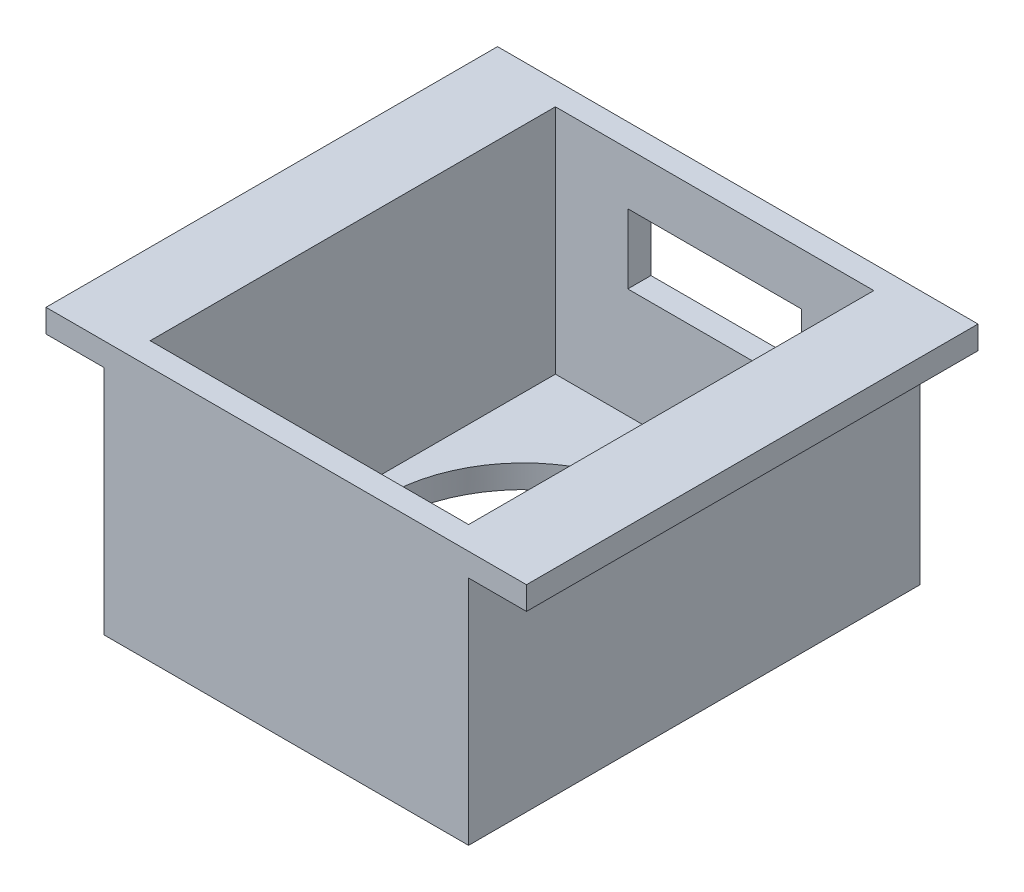
ISO-10303-21;
HEADER;
FILE_DESCRIPTION(('STEP AP214'),'2;1');
FILE_NAME('part.step','',(''),(''),'','','');
FILE_SCHEMA(('AUTOMOTIVE_DESIGN { 1 0 10303 214 1 1 1 1 }'));
ENDSEC;
DATA;
#1=APPLICATION_CONTEXT('core data for automotive mechanical design processes');
#2=APPLICATION_PROTOCOL_DEFINITION('international standard','automotive_design',2000,#1);
#3=PRODUCT_CONTEXT('',#1,'mechanical');
#4=PRODUCT('Part','Part','',(#3));
#5=PRODUCT_RELATED_PRODUCT_CATEGORY('part','',(#4));
#6=PRODUCT_DEFINITION_FORMATION('','',#4);
#7=PRODUCT_DEFINITION_CONTEXT('part definition',#1,'design');
#8=PRODUCT_DEFINITION('design','',#6,#7);
#9=PRODUCT_DEFINITION_SHAPE('','',#8);
#10=(LENGTH_UNIT() NAMED_UNIT(*) SI_UNIT(.MILLI.,.METRE.));
#11=(NAMED_UNIT(*) PLANE_ANGLE_UNIT() SI_UNIT($,.RADIAN.));
#12=(NAMED_UNIT(*) SI_UNIT($,.STERADIAN.) SOLID_ANGLE_UNIT());
#13=UNCERTAINTY_MEASURE_WITH_UNIT(LENGTH_MEASURE(1.E-05),#10,'distance_accuracy_value','');
#14=(GEOMETRIC_REPRESENTATION_CONTEXT(3) GLOBAL_UNCERTAINTY_ASSIGNED_CONTEXT((#13)) GLOBAL_UNIT_ASSIGNED_CONTEXT((#10,
#11,#12)) REPRESENTATION_CONTEXT('',''));
#15=CARTESIAN_POINT('',(0.,0.,0.));
#16=DIRECTION('',(0.,0.,1.));
#17=DIRECTION('',(1.,0.,0.));
#18=AXIS2_PLACEMENT_3D('',#15,#16,#17);
#19=CARTESIAN_POINT('',(34.5,-20.,37.));
#20=DIRECTION('',(1.,0.,0.));
#21=DIRECTION('',(0.,0.,-1.));
#22=AXIS2_PLACEMENT_3D('',#19,#20,#21);
#23=PLANE('',#22);
#24=DIRECTION('',(0.,1.,0.));
#25=VECTOR('',#24,1.);
#26=CARTESIAN_POINT('',(34.5,-20.,1.99999999999999));
#27=LINE('',#26,#25);
#28=CARTESIAN_POINT('',(34.5,-20.,1.99999999999999));
#29=VERTEX_POINT('',#28);
#30=CARTESIAN_POINT('',(34.5,0.,1.99999999999999));
#31=VERTEX_POINT('',#30);
#32=EDGE_CURVE('E183',#29,#31,#27,.T.);
#33=ORIENTED_EDGE('',*,*,#32,.F.);
#34=DIRECTION('',(0.,0.,-1.));
#35=VECTOR('',#34,1.);
#36=CARTESIAN_POINT('',(34.5,-20.,37.));
#37=LINE('',#36,#35);
#38=CARTESIAN_POINT('',(34.5,-20.,37.));
#39=VERTEX_POINT('',#38);
#40=EDGE_CURVE('E234',#39,#29,#37,.T.);
#41=ORIENTED_EDGE('',*,*,#40,.F.);
#42=DIRECTION('',(0.,-1.,0.));
#43=VECTOR('',#42,1.);
#44=CARTESIAN_POINT('',(34.5,-20.,37.));
#45=LINE('',#44,#43);
#46=CARTESIAN_POINT('',(34.5,0.,37.));
#47=VERTEX_POINT('',#46);
#48=EDGE_CURVE('E220',#47,#39,#45,.T.);
#49=ORIENTED_EDGE('',*,*,#48,.F.);
#50=DIRECTION('',(0.,0.,-1.));
#51=VECTOR('',#50,1.);
#52=CARTESIAN_POINT('',(34.5,0.,37.));
#53=LINE('',#52,#51);
#54=EDGE_CURVE('E231',#47,#31,#53,.T.);
#55=ORIENTED_EDGE('',*,*,#54,.T.);
#56=EDGE_LOOP('',(#33,#41,#49,#55));
#57=FACE_BOUND('',#56,.T.);
#58=ADVANCED_FACE('F33',(#57),#23,.F.);
#59=CARTESIAN_POINT('',(7.,-20.,37.));
#60=DIRECTION('',(0.,-1.,0.));
#61=DIRECTION('',(1.,0.,0.));
#62=AXIS2_PLACEMENT_3D('',#59,#60,#61);
#63=PLANE('',#62);
#64=CARTESIAN_POINT('',(20.75,-20.,18.5));
#65=DIRECTION('',(0.,-1.,0.));
#66=DIRECTION('',(1.,0.,0.));
#67=AXIS2_PLACEMENT_3D('',#64,#65,#66);
#68=CIRCLE('',#67,12.);
#69=CARTESIAN_POINT('',(32.75,-20.,18.5));
#70=VERTEX_POINT('',#69);
#71=EDGE_CURVE('E459',#70,#70,#68,.T.);
#72=ORIENTED_EDGE('',*,*,#71,.T.);
#73=EDGE_LOOP('',(#72));
#74=FACE_BOUND('',#73,.T.);
#75=DIRECTION('',(1.,0.,0.));
#76=VECTOR('',#75,1.);
#77=CARTESIAN_POINT('',(7.,-20.,1.99999999999999));
#78=LINE('',#77,#76);
#79=CARTESIAN_POINT('',(7.,-20.,1.99999999999999));
#80=VERTEX_POINT('',#79);
#81=EDGE_CURVE('E180',#80,#29,#78,.T.);
#82=ORIENTED_EDGE('',*,*,#81,.F.);
#83=DIRECTION('',(0.,0.,-1.));
#84=VECTOR('',#83,1.);
#85=CARTESIAN_POINT('',(7.,-20.,37.));
#86=LINE('',#85,#84);
#87=CARTESIAN_POINT('',(7.,-20.,37.));
#88=VERTEX_POINT('',#87);
#89=EDGE_CURVE('E332',#88,#80,#86,.T.);
#90=ORIENTED_EDGE('',*,*,#89,.F.);
#91=DIRECTION('',(-1.,0.,0.));
#92=VECTOR('',#91,1.);
#93=CARTESIAN_POINT('',(7.,-20.,37.));
#94=LINE('',#93,#92);
#95=EDGE_CURVE('E216',#39,#88,#94,.T.);
#96=ORIENTED_EDGE('',*,*,#95,.F.);
#97=ORIENTED_EDGE('',*,*,#40,.T.);
#98=EDGE_LOOP('',(#82,#90,#96,#97));
#99=FACE_BOUND('',#98,.T.);
#100=ADVANCED_FACE('F264',(#74,#99),#63,.F.);
#101=CARTESIAN_POINT('',(7.,0.,37.));
#102=DIRECTION('',(-1.,0.,0.));
#103=DIRECTION('',(0.,-1.,0.));
#104=AXIS2_PLACEMENT_3D('',#101,#102,#103);
#105=PLANE('',#104);
#106=DIRECTION('',(0.,-1.,0.));
#107=VECTOR('',#106,1.);
#108=CARTESIAN_POINT('',(7.,0.,1.99999999999999));
#109=LINE('',#108,#107);
#110=CARTESIAN_POINT('',(7.,0.,1.99999999999999));
#111=VERTEX_POINT('',#110);
#112=EDGE_CURVE('E177',#111,#80,#109,.T.);
#113=ORIENTED_EDGE('',*,*,#112,.F.);
#114=DIRECTION('',(0.,0.,-1.));
#115=VECTOR('',#114,1.);
#116=CARTESIAN_POINT('',(7.,0.,37.));
#117=LINE('',#116,#115);
#118=CARTESIAN_POINT('',(7.,0.,37.));
#119=VERTEX_POINT('',#118);
#120=EDGE_CURVE('E331',#119,#111,#117,.T.);
#121=ORIENTED_EDGE('',*,*,#120,.F.);
#122=DIRECTION('',(0.,1.,0.));
#123=VECTOR('',#122,1.);
#124=CARTESIAN_POINT('',(7.,0.,37.));
#125=LINE('',#124,#123);
#126=EDGE_CURVE('E219',#88,#119,#125,.T.);
#127=ORIENTED_EDGE('',*,*,#126,.F.);
#128=ORIENTED_EDGE('',*,*,#89,.T.);
#129=EDGE_LOOP('',(#113,#121,#127,#128));
#130=FACE_BOUND('',#129,.T.);
#131=ADVANCED_FACE('F270',(#130),#105,.F.);
#132=CARTESIAN_POINT('',(0.,-2.,37.));
#133=DIRECTION('',(1.,0.,0.));
#134=DIRECTION('',(0.,0.,-1.));
#135=AXIS2_PLACEMENT_3D('',#132,#133,#134);
#136=PLANE('',#135);
#137=DIRECTION('',(0.,-1.,0.));
#138=VECTOR('',#137,1.);
#139=CARTESIAN_POINT('',(0.,-2.,0.));
#140=LINE('',#139,#138);
#141=CARTESIAN_POINT('',(0.,0.,0.));
#142=VERTEX_POINT('',#141);
#143=CARTESIAN_POINT('',(0.,-2.,0.));
#144=VERTEX_POINT('',#143);
#145=EDGE_CURVE('E211',#142,#144,#140,.T.);
#146=ORIENTED_EDGE('',*,*,#145,.T.);
#147=DIRECTION('',(0.,0.,-1.));
#148=VECTOR('',#147,1.);
#149=CARTESIAN_POINT('',(0.,-2.,37.));
#150=LINE('',#149,#148);
#151=CARTESIAN_POINT('',(0.,-2.,39.));
#152=VERTEX_POINT('',#151);
#153=EDGE_CURVE('E244',#152,#144,#150,.T.);
#154=ORIENTED_EDGE('',*,*,#153,.F.);
#155=DIRECTION('',(0.,-1.,0.));
#156=VECTOR('',#155,1.);
#157=CARTESIAN_POINT('',(0.,-2.,39.));
#158=LINE('',#157,#156);
#159=CARTESIAN_POINT('',(0.,0.,39.));
#160=VERTEX_POINT('',#159);
#161=EDGE_CURVE('E187',#160,#152,#158,.T.);
#162=ORIENTED_EDGE('',*,*,#161,.F.);
#163=DIRECTION('',(0.,0.,-1.));
#164=VECTOR('',#163,1.);
#165=CARTESIAN_POINT('',(0.,0.,37.));
#166=LINE('',#165,#164);
#167=EDGE_CURVE('E228',#160,#142,#166,.T.);
#168=ORIENTED_EDGE('',*,*,#167,.T.);
#169=EDGE_LOOP('',(#146,#154,#162,#168));
#170=FACE_BOUND('',#169,.T.);
#171=ADVANCED_FACE('F35',(#170),#136,.F.);
#172=CARTESIAN_POINT('',(0.,-2.,37.));
#173=DIRECTION('',(0.,1.,0.));
#174=DIRECTION('',(0.,0.,1.));
#175=AXIS2_PLACEMENT_3D('',#172,#173,#174);
#176=PLANE('',#175);
#177=DIRECTION('',(1.,0.,0.));
#178=VECTOR('',#177,1.);
#179=CARTESIAN_POINT('',(0.,-2.,0.));
#180=LINE('',#179,#178);
#181=CARTESIAN_POINT('',(5.,-2.,0.));
#182=VERTEX_POINT('',#181);
#183=EDGE_CURVE('E304',#144,#182,#180,.T.);
#184=ORIENTED_EDGE('',*,*,#183,.T.);
#185=DIRECTION('',(0.,0.,-1.));
#186=VECTOR('',#185,1.);
#187=CARTESIAN_POINT('',(5.,-2.,37.));
#188=LINE('',#187,#186);
#189=CARTESIAN_POINT('',(5.,-2.,39.));
#190=VERTEX_POINT('',#189);
#191=EDGE_CURVE('E307',#190,#182,#188,.T.);
#192=ORIENTED_EDGE('',*,*,#191,.F.);
#193=DIRECTION('',(1.,0.,0.));
#194=VECTOR('',#193,1.);
#195=CARTESIAN_POINT('',(5.,-2.,39.));
#196=LINE('',#195,#194);
#197=EDGE_CURVE('E190',#152,#190,#196,.T.);
#198=ORIENTED_EDGE('',*,*,#197,.F.);
#199=ORIENTED_EDGE('',*,*,#153,.T.);
#200=EDGE_LOOP('',(#184,#192,#198,#199));
#201=FACE_BOUND('',#200,.T.);
#202=ADVANCED_FACE('F294',(#201),#176,.F.);
#203=CARTESIAN_POINT('',(5.,-2.,37.));
#204=DIRECTION('',(1.,0.,0.));
#205=DIRECTION('',(0.,1.,0.));
#206=AXIS2_PLACEMENT_3D('',#203,#204,#205);
#207=PLANE('',#206);
#208=DIRECTION('',(0.,-1.,0.));
#209=VECTOR('',#208,1.);
#210=CARTESIAN_POINT('',(5.,-2.,0.));
#211=LINE('',#210,#209);
#212=CARTESIAN_POINT('',(5.,-22.,0.));
#213=VERTEX_POINT('',#212);
#214=EDGE_CURVE('E310',#182,#213,#211,.T.);
#215=ORIENTED_EDGE('',*,*,#214,.T.);
#216=DIRECTION('',(0.,0.,-1.));
#217=VECTOR('',#216,1.);
#218=CARTESIAN_POINT('',(5.,-22.,37.));
#219=LINE('',#218,#217);
#220=CARTESIAN_POINT('',(5.,-22.,39.));
#221=VERTEX_POINT('',#220);
#222=EDGE_CURVE('E343',#221,#213,#219,.T.);
#223=ORIENTED_EDGE('',*,*,#222,.F.);
#224=DIRECTION('',(0.,-1.,0.));
#225=VECTOR('',#224,1.);
#226=CARTESIAN_POINT('',(5.,-22.,39.));
#227=LINE('',#226,#225);
#228=EDGE_CURVE('E193',#190,#221,#227,.T.);
#229=ORIENTED_EDGE('',*,*,#228,.F.);
#230=ORIENTED_EDGE('',*,*,#191,.T.);
#231=EDGE_LOOP('',(#215,#223,#229,#230));
#232=FACE_BOUND('',#231,.T.);
#233=ADVANCED_FACE('F291',(#232),#207,.F.);
#234=CARTESIAN_POINT('',(5.,-22.,37.));
#235=DIRECTION('',(0.,1.,0.));
#236=DIRECTION('',(0.,0.,1.));
#237=AXIS2_PLACEMENT_3D('',#234,#235,#236);
#238=PLANE('',#237);
#239=CARTESIAN_POINT('',(20.75,-22.,18.5));
#240=DIRECTION('',(0.,-1.,0.));
#241=DIRECTION('',(0.,0.,-1.));
#242=AXIS2_PLACEMENT_3D('',#239,#240,#241);
#243=CIRCLE('',#242,12.);
#244=CARTESIAN_POINT('',(20.75,-22.,6.5));
#245=VERTEX_POINT('',#244);
#246=EDGE_CURVE('E456',#245,#245,#243,.T.);
#247=ORIENTED_EDGE('',*,*,#246,.F.);
#248=EDGE_LOOP('',(#247));
#249=FACE_BOUND('',#248,.T.);
#250=DIRECTION('',(1.,0.,0.));
#251=VECTOR('',#250,1.);
#252=CARTESIAN_POINT('',(5.,-22.,0.));
#253=LINE('',#252,#251);
#254=CARTESIAN_POINT('',(36.5,-22.,0.));
#255=VERTEX_POINT('',#254);
#256=EDGE_CURVE('E315',#213,#255,#253,.T.);
#257=ORIENTED_EDGE('',*,*,#256,.T.);
#258=DIRECTION('',(0.,0.,-1.));
#259=VECTOR('',#258,1.);
#260=CARTESIAN_POINT('',(36.5,-22.,37.));
#261=LINE('',#260,#259);
#262=CARTESIAN_POINT('',(36.5,-22.,39.));
#263=VERTEX_POINT('',#262);
#264=EDGE_CURVE('E341',#263,#255,#261,.T.);
#265=ORIENTED_EDGE('',*,*,#264,.F.);
#266=DIRECTION('',(1.,0.,0.));
#267=VECTOR('',#266,1.);
#268=CARTESIAN_POINT('',(36.5,-22.,39.));
#269=LINE('',#268,#267);
#270=EDGE_CURVE('E196',#221,#263,#269,.T.);
#271=ORIENTED_EDGE('',*,*,#270,.F.);
#272=ORIENTED_EDGE('',*,*,#222,.T.);
#273=EDGE_LOOP('',(#257,#265,#271,#272));
#274=FACE_BOUND('',#273,.T.);
#275=ADVANCED_FACE('F287',(#249,#274),#238,.F.);
#276=CARTESIAN_POINT('',(36.5,-22.,37.));
#277=DIRECTION('',(-1.,0.,0.));
#278=DIRECTION('',(0.,0.,1.));
#279=AXIS2_PLACEMENT_3D('',#276,#277,#278);
#280=PLANE('',#279);
#281=DIRECTION('',(0.,1.,0.));
#282=VECTOR('',#281,1.);
#283=CARTESIAN_POINT('',(36.5,-22.,0.));
#284=LINE('',#283,#282);
#285=CARTESIAN_POINT('',(36.5,-2.,0.));
#286=VERTEX_POINT('',#285);
#287=EDGE_CURVE('E317',#255,#286,#284,.T.);
#288=ORIENTED_EDGE('',*,*,#287,.T.);
#289=DIRECTION('',(0.,0.,-1.));
#290=VECTOR('',#289,1.);
#291=CARTESIAN_POINT('',(36.5,-2.,37.));
#292=LINE('',#291,#290);
#293=CARTESIAN_POINT('',(36.5,-2.,39.));
#294=VERTEX_POINT('',#293);
#295=EDGE_CURVE('E339',#294,#286,#292,.T.);
#296=ORIENTED_EDGE('',*,*,#295,.F.);
#297=DIRECTION('',(0.,1.,0.));
#298=VECTOR('',#297,1.);
#299=CARTESIAN_POINT('',(36.5,-2.,39.));
#300=LINE('',#299,#298);
#301=EDGE_CURVE('E199',#263,#294,#300,.T.);
#302=ORIENTED_EDGE('',*,*,#301,.F.);
#303=ORIENTED_EDGE('',*,*,#264,.T.);
#304=EDGE_LOOP('',(#288,#296,#302,#303));
#305=FACE_BOUND('',#304,.T.);
#306=ADVANCED_FACE('F283',(#305),#280,.F.);
#307=CARTESIAN_POINT('',(36.5,-2.,37.));
#308=DIRECTION('',(0.,1.,0.));
#309=DIRECTION('',(0.,0.,1.));
#310=AXIS2_PLACEMENT_3D('',#307,#308,#309);
#311=PLANE('',#310);
#312=DIRECTION('',(1.,0.,0.));
#313=VECTOR('',#312,1.);
#314=CARTESIAN_POINT('',(36.5,-2.,0.));
#315=LINE('',#314,#313);
#316=CARTESIAN_POINT('',(41.5,-2.,0.));
#317=VERTEX_POINT('',#316);
#318=EDGE_CURVE('E322',#286,#317,#315,.T.);
#319=ORIENTED_EDGE('',*,*,#318,.T.);
#320=DIRECTION('',(0.,0.,-1.));
#321=VECTOR('',#320,1.);
#322=CARTESIAN_POINT('',(41.5,-2.,37.));
#323=LINE('',#322,#321);
#324=CARTESIAN_POINT('',(41.5,-2.,39.));
#325=VERTEX_POINT('',#324);
#326=EDGE_CURVE('E337',#325,#317,#323,.T.);
#327=ORIENTED_EDGE('',*,*,#326,.F.);
#328=DIRECTION('',(1.,0.,0.));
#329=VECTOR('',#328,1.);
#330=CARTESIAN_POINT('',(41.5,-2.,39.));
#331=LINE('',#330,#329);
#332=EDGE_CURVE('E202',#294,#325,#331,.T.);
#333=ORIENTED_EDGE('',*,*,#332,.F.);
#334=ORIENTED_EDGE('',*,*,#295,.T.);
#335=EDGE_LOOP('',(#319,#327,#333,#334));
#336=FACE_BOUND('',#335,.T.);
#337=ADVANCED_FACE('F279',(#336),#311,.F.);
#338=CARTESIAN_POINT('',(41.5,0.,37.));
#339=DIRECTION('',(-1.,0.,0.));
#340=DIRECTION('',(0.,0.,1.));
#341=AXIS2_PLACEMENT_3D('',#338,#339,#340);
#342=PLANE('',#341);
#343=DIRECTION('',(0.,1.,0.));
#344=VECTOR('',#343,1.);
#345=CARTESIAN_POINT('',(41.5,0.,0.));
#346=LINE('',#345,#344);
#347=CARTESIAN_POINT('',(41.5,0.,0.));
#348=VERTEX_POINT('',#347);
#349=EDGE_CURVE('E325',#317,#348,#346,.T.);
#350=ORIENTED_EDGE('',*,*,#349,.T.);
#351=DIRECTION('',(0.,0.,-1.));
#352=VECTOR('',#351,1.);
#353=CARTESIAN_POINT('',(41.5,0.,37.));
#354=LINE('',#353,#352);
#355=CARTESIAN_POINT('',(41.5,0.,39.));
#356=VERTEX_POINT('',#355);
#357=EDGE_CURVE('E233',#356,#348,#354,.T.);
#358=ORIENTED_EDGE('',*,*,#357,.F.);
#359=DIRECTION('',(0.,1.,0.));
#360=VECTOR('',#359,1.);
#361=CARTESIAN_POINT('',(41.5,0.,39.));
#362=LINE('',#361,#360);
#363=EDGE_CURVE('E205',#325,#356,#362,.T.);
#364=ORIENTED_EDGE('',*,*,#363,.F.);
#365=ORIENTED_EDGE('',*,*,#326,.T.);
#366=EDGE_LOOP('',(#350,#358,#364,#365));
#367=FACE_BOUND('',#366,.T.);
#368=ADVANCED_FACE('F275',(#367),#342,.F.);
#369=CARTESIAN_POINT('',(0.,0.,37.));
#370=DIRECTION('',(0.,-1.,0.));
#371=DIRECTION('',(0.,0.,-1.));
#372=AXIS2_PLACEMENT_3D('',#369,#370,#371);
#373=PLANE('',#372);
#374=DIRECTION('',(-1.,0.,0.));
#375=VECTOR('',#374,1.);
#376=CARTESIAN_POINT('',(0.,0.,1.99999999999999));
#377=LINE('',#376,#375);
#378=EDGE_CURVE('E172',#31,#111,#377,.T.);
#379=ORIENTED_EDGE('',*,*,#378,.F.);
#380=ORIENTED_EDGE('',*,*,#54,.F.);
#381=DIRECTION('',(-1.,0.,0.));
#382=VECTOR('',#381,1.);
#383=CARTESIAN_POINT('',(0.,0.,37.));
#384=LINE('',#383,#382);
#385=EDGE_CURVE('E186',#47,#119,#384,.T.);
#386=ORIENTED_EDGE('',*,*,#385,.T.);
#387=ORIENTED_EDGE('',*,*,#120,.T.);
#388=EDGE_LOOP('',(#379,#380,#386,#387));
#389=FACE_BOUND('',#388,.T.);
#390=ORIENTED_EDGE('',*,*,#357,.T.);
#391=DIRECTION('',(-1.,0.,0.));
#392=VECTOR('',#391,1.);
#393=CARTESIAN_POINT('',(0.,0.,0.));
#394=LINE('',#393,#392);
#395=EDGE_CURVE('E239',#348,#142,#394,.T.);
#396=ORIENTED_EDGE('',*,*,#395,.T.);
#397=ORIENTED_EDGE('',*,*,#167,.F.);
#398=DIRECTION('',(-1.,0.,0.));
#399=VECTOR('',#398,1.);
#400=CARTESIAN_POINT('',(0.,0.,39.));
#401=LINE('',#400,#399);
#402=EDGE_CURVE('E208',#356,#160,#401,.T.);
#403=ORIENTED_EDGE('',*,*,#402,.F.);
#404=EDGE_LOOP('',(#390,#396,#397,#403));
#405=FACE_BOUND('',#404,.T.);
#406=ADVANCED_FACE('F278',(#389,#405),#373,.F.);
#407=CARTESIAN_POINT('',(0.,0.,0.));
#408=DIRECTION('',(0.,0.,-1.));
#409=DIRECTION('',(-1.,0.,0.));
#410=AXIS2_PLACEMENT_3D('',#407,#408,#409);
#411=PLANE('',#410);
#412=DIRECTION('',(1.,0.,0.));
#413=VECTOR('',#412,1.);
#414=CARTESIAN_POINT('',(28.25,-4.5,0.));
#415=LINE('',#414,#413);
#416=CARTESIAN_POINT('',(13.25,-4.5,0.));
#417=VERTEX_POINT('',#416);
#418=CARTESIAN_POINT('',(28.25,-4.5,0.));
#419=VERTEX_POINT('',#418);
#420=EDGE_CURVE('E48',#417,#419,#415,.T.);
#421=ORIENTED_EDGE('',*,*,#420,.F.);
#422=DIRECTION('',(0.,1.,0.));
#423=VECTOR('',#422,1.);
#424=CARTESIAN_POINT('',(13.25,-4.5,0.));
#425=LINE('',#424,#423);
#426=CARTESIAN_POINT('',(13.25,-10.5,0.));
#427=VERTEX_POINT('',#426);
#428=EDGE_CURVE('E165',#427,#417,#425,.T.);
#429=ORIENTED_EDGE('',*,*,#428,.F.);
#430=DIRECTION('',(-1.,0.,0.));
#431=VECTOR('',#430,1.);
#432=CARTESIAN_POINT('',(28.25,-10.5,0.));
#433=LINE('',#432,#431);
#434=CARTESIAN_POINT('',(28.25,-10.5,0.));
#435=VERTEX_POINT('',#434);
#436=EDGE_CURVE('E149',#435,#427,#433,.T.);
#437=ORIENTED_EDGE('',*,*,#436,.F.);
#438=DIRECTION('',(0.,-1.,0.));
#439=VECTOR('',#438,1.);
#440=CARTESIAN_POINT('',(28.25,-4.5,0.));
#441=LINE('',#440,#439);
#442=EDGE_CURVE('E158',#419,#435,#441,.T.);
#443=ORIENTED_EDGE('',*,*,#442,.F.);
#444=EDGE_LOOP('',(#421,#429,#437,#443));
#445=FACE_BOUND('',#444,.T.);
#446=ORIENTED_EDGE('',*,*,#145,.F.);
#447=ORIENTED_EDGE('',*,*,#395,.F.);
#448=ORIENTED_EDGE('',*,*,#349,.F.);
#449=ORIENTED_EDGE('',*,*,#318,.F.);
#450=ORIENTED_EDGE('',*,*,#287,.F.);
#451=ORIENTED_EDGE('',*,*,#256,.F.);
#452=ORIENTED_EDGE('',*,*,#214,.F.);
#453=ORIENTED_EDGE('',*,*,#183,.F.);
#454=EDGE_LOOP('',(#446,#447,#448,#449,#450,#451,#452,#453));
#455=FACE_BOUND('',#454,.T.);
#456=ADVANCED_FACE('F162',(#445,#455),#411,.T.);
#457=CARTESIAN_POINT('',(0.,0.,39.));
#458=DIRECTION('',(0.,0.,-1.));
#459=DIRECTION('',(-1.,0.,0.));
#460=AXIS2_PLACEMENT_3D('',#457,#458,#459);
#461=PLANE('',#460);
#462=ORIENTED_EDGE('',*,*,#161,.T.);
#463=ORIENTED_EDGE('',*,*,#197,.T.);
#464=ORIENTED_EDGE('',*,*,#228,.T.);
#465=ORIENTED_EDGE('',*,*,#270,.T.);
#466=ORIENTED_EDGE('',*,*,#301,.T.);
#467=ORIENTED_EDGE('',*,*,#332,.T.);
#468=ORIENTED_EDGE('',*,*,#363,.T.);
#469=ORIENTED_EDGE('',*,*,#402,.T.);
#470=EDGE_LOOP('',(#462,#463,#464,#465,#466,#467,#468,#469));
#471=FACE_BOUND('',#470,.T.);
#472=ADVANCED_FACE('F366',(#471),#461,.F.);
#473=CARTESIAN_POINT('',(0.,0.,37.));
#474=DIRECTION('',(0.,0.,-1.));
#475=DIRECTION('',(-1.,0.,0.));
#476=AXIS2_PLACEMENT_3D('',#473,#474,#475);
#477=PLANE('',#476);
#478=ORIENTED_EDGE('',*,*,#385,.F.);
#479=ORIENTED_EDGE('',*,*,#48,.T.);
#480=ORIENTED_EDGE('',*,*,#95,.T.);
#481=ORIENTED_EDGE('',*,*,#126,.T.);
#482=EDGE_LOOP('',(#478,#479,#480,#481));
#483=FACE_BOUND('',#482,.T.);
#484=ADVANCED_FACE('F260',(#483),#477,.T.);
#485=CARTESIAN_POINT('',(0.,0.,1.99999999999999));
#486=DIRECTION('',(0.,0.,-1.));
#487=DIRECTION('',(-1.,0.,0.));
#488=AXIS2_PLACEMENT_3D('',#485,#486,#487);
#489=PLANE('',#488);
#490=DIRECTION('',(0.,1.,0.));
#491=VECTOR('',#490,1.);
#492=CARTESIAN_POINT('',(13.25,0.,1.99999999999999));
#493=LINE('',#492,#491);
#494=CARTESIAN_POINT('',(13.25,-10.5,1.99999999999999));
#495=VERTEX_POINT('',#494);
#496=CARTESIAN_POINT('',(13.25,-4.5,1.99999999999999));
#497=VERTEX_POINT('',#496);
#498=EDGE_CURVE('E41',#495,#497,#493,.T.);
#499=ORIENTED_EDGE('',*,*,#498,.T.);
#500=DIRECTION('',(1.,0.,0.));
#501=VECTOR('',#500,1.);
#502=CARTESIAN_POINT('',(0.,-4.5,1.99999999999999));
#503=LINE('',#502,#501);
#504=CARTESIAN_POINT('',(28.25,-4.5,1.99999999999999));
#505=VERTEX_POINT('',#504);
#506=EDGE_CURVE('E11',#497,#505,#503,.T.);
#507=ORIENTED_EDGE('',*,*,#506,.T.);
#508=DIRECTION('',(0.,-1.,0.));
#509=VECTOR('',#508,1.);
#510=CARTESIAN_POINT('',(28.25,0.,1.99999999999999));
#511=LINE('',#510,#509);
#512=CARTESIAN_POINT('',(28.25,-10.5,1.99999999999999));
#513=VERTEX_POINT('',#512);
#514=EDGE_CURVE('E242',#505,#513,#511,.T.);
#515=ORIENTED_EDGE('',*,*,#514,.T.);
#516=DIRECTION('',(-1.,0.,0.));
#517=VECTOR('',#516,1.);
#518=CARTESIAN_POINT('',(0.,-10.5,1.99999999999999));
#519=LINE('',#518,#517);
#520=EDGE_CURVE('E152',#513,#495,#519,.T.);
#521=ORIENTED_EDGE('',*,*,#520,.T.);
#522=EDGE_LOOP('',(#499,#507,#515,#521));
#523=FACE_BOUND('',#522,.T.);
#524=ORIENTED_EDGE('',*,*,#81,.T.);
#525=ORIENTED_EDGE('',*,*,#32,.T.);
#526=ORIENTED_EDGE('',*,*,#378,.T.);
#527=ORIENTED_EDGE('',*,*,#112,.T.);
#528=EDGE_LOOP('',(#524,#525,#526,#527));
#529=FACE_BOUND('',#528,.T.);
#530=ADVANCED_FACE('F247',(#523,#529),#489,.F.);
#531=CARTESIAN_POINT('',(28.25,-4.5,10.));
#532=DIRECTION('',(0.,1.,0.));
#533=DIRECTION('',(0.,0.,1.));
#534=AXIS2_PLACEMENT_3D('',#531,#532,#533);
#535=PLANE('',#534);
#536=DIRECTION('',(0.,0.,-1.));
#537=VECTOR('',#536,1.);
#538=CARTESIAN_POINT('',(13.25,-4.5,10.));
#539=LINE('',#538,#537);
#540=EDGE_CURVE('E170',#497,#417,#539,.T.);
#541=ORIENTED_EDGE('',*,*,#540,.T.);
#542=ORIENTED_EDGE('',*,*,#420,.T.);
#543=DIRECTION('',(0.,0.,-1.));
#544=VECTOR('',#543,1.);
#545=CARTESIAN_POINT('',(28.25,-4.5,10.));
#546=LINE('',#545,#544);
#547=EDGE_CURVE('E155',#505,#419,#546,.T.);
#548=ORIENTED_EDGE('',*,*,#547,.F.);
#549=ORIENTED_EDGE('',*,*,#506,.F.);
#550=EDGE_LOOP('',(#541,#542,#548,#549));
#551=FACE_BOUND('',#550,.T.);
#552=ADVANCED_FACE('F252',(#551),#535,.F.);
#553=CARTESIAN_POINT('',(13.25,-4.5,10.));
#554=DIRECTION('',(-1.,0.,0.));
#555=DIRECTION('',(0.,0.,1.));
#556=AXIS2_PLACEMENT_3D('',#553,#554,#555);
#557=PLANE('',#556);
#558=DIRECTION('',(0.,0.,-1.));
#559=VECTOR('',#558,1.);
#560=CARTESIAN_POINT('',(13.25,-10.5,10.));
#561=LINE('',#560,#559);
#562=EDGE_CURVE('E154',#495,#427,#561,.T.);
#563=ORIENTED_EDGE('',*,*,#562,.T.);
#564=ORIENTED_EDGE('',*,*,#428,.T.);
#565=ORIENTED_EDGE('',*,*,#540,.F.);
#566=ORIENTED_EDGE('',*,*,#498,.F.);
#567=EDGE_LOOP('',(#563,#564,#565,#566));
#568=FACE_BOUND('',#567,.T.);
#569=ADVANCED_FACE('F251',(#568),#557,.F.);
#570=CARTESIAN_POINT('',(28.25,-10.5,10.));
#571=DIRECTION('',(0.,-1.,0.));
#572=DIRECTION('',(0.,0.,-1.));
#573=AXIS2_PLACEMENT_3D('',#570,#571,#572);
#574=PLANE('',#573);
#575=DIRECTION('',(0.,0.,-1.));
#576=VECTOR('',#575,1.);
#577=CARTESIAN_POINT('',(28.25,-10.5,10.));
#578=LINE('',#577,#576);
#579=EDGE_CURVE('E56',#513,#435,#578,.T.);
#580=ORIENTED_EDGE('',*,*,#579,.T.);
#581=ORIENTED_EDGE('',*,*,#436,.T.);
#582=ORIENTED_EDGE('',*,*,#562,.F.);
#583=ORIENTED_EDGE('',*,*,#520,.F.);
#584=EDGE_LOOP('',(#580,#581,#582,#583));
#585=FACE_BOUND('',#584,.T.);
#586=ADVANCED_FACE('F146',(#585),#574,.F.);
#587=CARTESIAN_POINT('',(28.25,-4.5,10.));
#588=DIRECTION('',(1.,0.,0.));
#589=DIRECTION('',(0.,0.,-1.));
#590=AXIS2_PLACEMENT_3D('',#587,#588,#589);
#591=PLANE('',#590);
#592=ORIENTED_EDGE('',*,*,#547,.T.);
#593=ORIENTED_EDGE('',*,*,#442,.T.);
#594=ORIENTED_EDGE('',*,*,#579,.F.);
#595=ORIENTED_EDGE('',*,*,#514,.F.);
#596=EDGE_LOOP('',(#592,#593,#594,#595));
#597=FACE_BOUND('',#596,.T.);
#598=ADVANCED_FACE('F159',(#597),#591,.F.);
#599=CARTESIAN_POINT('',(20.75,-12.,18.5));
#600=DIRECTION('',(0.,-1.,0.));
#601=DIRECTION('',(0.,0.,-1.));
#602=AXIS2_PLACEMENT_3D('',#599,#600,#601);
#603=CYLINDRICAL_SURFACE('',#602,12.);
#604=ORIENTED_EDGE('',*,*,#246,.T.);
#605=EDGE_LOOP('',(#604));
#606=FACE_BOUND('',#605,.T.);
#607=ORIENTED_EDGE('',*,*,#71,.F.);
#608=EDGE_LOOP('',(#607));
#609=FACE_BOUND('',#608,.T.);
#610=ADVANCED_FACE('F424',(#606,#609),#603,.F.);
#611=CLOSED_SHELL('',(#58,#100,#131,#171,#202,#233,#275,#306,#337,#368,#406,#456,#472,#484,#530,
#552,#569,#586,#598,#610));
#612=MANIFOLD_SOLID_BREP('B2',#611);
#613=ADVANCED_BREP_SHAPE_REPRESENTATION('',(#18,#612),#14);
#614=SHAPE_DEFINITION_REPRESENTATION(#9,#613);
ENDSEC;
END-ISO-10303-21;
